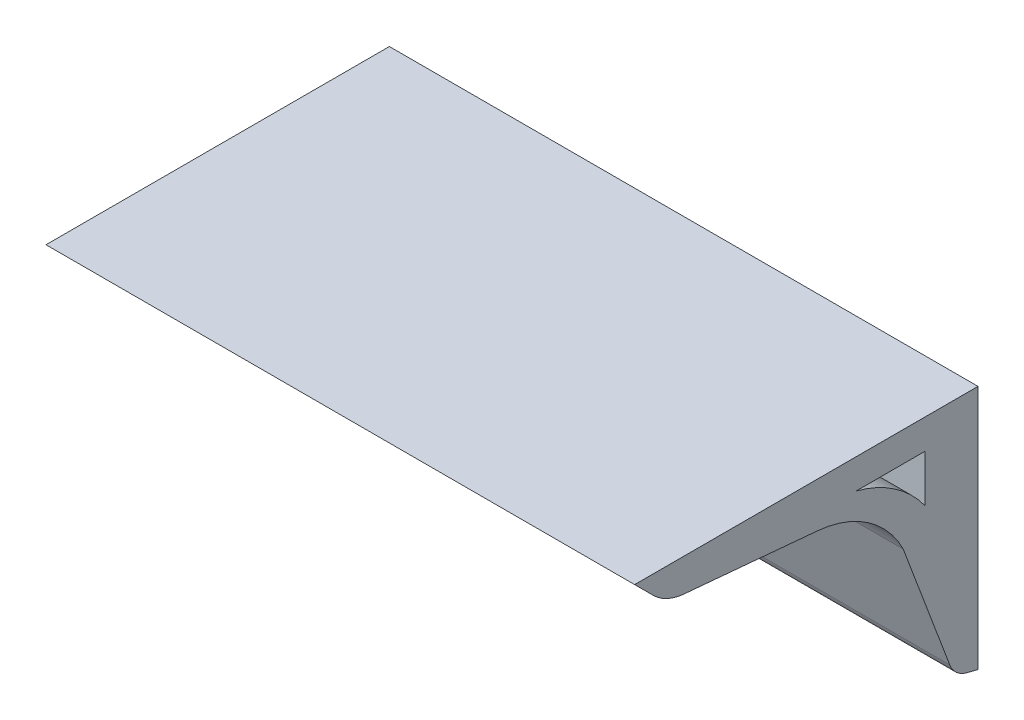
ISO-10303-21;
HEADER;
FILE_DESCRIPTION(('STEP AP214'),'2;1');
FILE_NAME('part.step','',(''),(''),'','','');
FILE_SCHEMA(('AUTOMOTIVE_DESIGN { 1 0 10303 214 1 1 1 1 }'));
ENDSEC;
DATA;
#1=APPLICATION_CONTEXT('core data for automotive mechanical design processes');
#2=APPLICATION_PROTOCOL_DEFINITION('international standard','automotive_design',2000,#1);
#3=PRODUCT_CONTEXT('',#1,'mechanical');
#4=PRODUCT('Part','Part','',(#3));
#5=PRODUCT_RELATED_PRODUCT_CATEGORY('part','',(#4));
#6=PRODUCT_DEFINITION_FORMATION('','',#4);
#7=PRODUCT_DEFINITION_CONTEXT('part definition',#1,'design');
#8=PRODUCT_DEFINITION('design','',#6,#7);
#9=PRODUCT_DEFINITION_SHAPE('','',#8);
#10=(LENGTH_UNIT() NAMED_UNIT(*) SI_UNIT(.MILLI.,.METRE.));
#11=(NAMED_UNIT(*) PLANE_ANGLE_UNIT() SI_UNIT($,.RADIAN.));
#12=(NAMED_UNIT(*) SI_UNIT($,.STERADIAN.) SOLID_ANGLE_UNIT());
#13=UNCERTAINTY_MEASURE_WITH_UNIT(LENGTH_MEASURE(1.E-05),#10,'distance_accuracy_value','');
#14=(GEOMETRIC_REPRESENTATION_CONTEXT(3) GLOBAL_UNCERTAINTY_ASSIGNED_CONTEXT((#13)) GLOBAL_UNIT_ASSIGNED_CONTEXT((#10,
#11,#12)) REPRESENTATION_CONTEXT('',''));
#15=CARTESIAN_POINT('',(0.,0.,0.));
#16=DIRECTION('',(0.,0.,1.));
#17=DIRECTION('',(1.,0.,0.));
#18=AXIS2_PLACEMENT_3D('',#15,#16,#17);
#19=CARTESIAN_POINT('',(140.700947131315,68.6280068728522,70.));
#20=DIRECTION('',(1.,0.,0.));
#21=DIRECTION('',(0.,0.,-1.));
#22=AXIS2_PLACEMENT_3D('',#19,#20,#21);
#23=PLANE('',#22);
#24=DIRECTION('',(0.,0.,1.));
#25=VECTOR('',#24,1.);
#26=CARTESIAN_POINT('',(140.700947131315,62.5711137957243,70.));
#27=LINE('',#26,#25);
#28=CARTESIAN_POINT('',(140.700947131315,62.5711137957243,10.7770424674494));
#29=VERTEX_POINT('',#28);
#30=CARTESIAN_POINT('',(140.700947131315,62.5711137957243,24.848704028638));
#31=VERTEX_POINT('',#30);
#32=EDGE_CURVE('E233',#29,#31,#27,.T.);
#33=ORIENTED_EDGE('',*,*,#32,.T.);
#34=CARTESIAN_POINT('',(140.700947131315,38.4790367793491,31.0267040762182));
#35=DIRECTION('',(1.,0.,0.));
#36=DIRECTION('',(0.,0.,-1.));
#37=AXIS2_PLACEMENT_3D('',#34,#35,#36);
#38=CIRCLE('',#37,24.8715873950751);
#39=CARTESIAN_POINT('',(140.700947131315,52.9201954683604,10.7770424674494));
#40=VERTEX_POINT('',#39);
#41=EDGE_CURVE('E135',#31,#40,#38,.F.);
#42=ORIENTED_EDGE('',*,*,#41,.T.);
#43=DIRECTION('',(0.,1.,0.));
#44=VECTOR('',#43,1.);
#45=CARTESIAN_POINT('',(140.700947131315,68.6280068728522,10.7770424674494));
#46=LINE('',#45,#44);
#47=EDGE_CURVE('E229',#40,#29,#46,.T.);
#48=ORIENTED_EDGE('',*,*,#47,.T.);
#49=EDGE_LOOP('',(#33,#42,#48));
#50=FACE_BOUND('',#49,.T.);
#51=CARTESIAN_POINT('',(140.700947131315,71.903004848522,59.1328623519387));
#52=DIRECTION('',(1.,0.,0.));
#53=DIRECTION('',(0.,0.,-1.));
#54=AXIS2_PLACEMENT_3D('',#51,#52,#53);
#55=CIRCLE('',#54,10.);
#56=CARTESIAN_POINT('',(140.700947131315,61.9433702759419,60.030458686973));
#57=VERTEX_POINT('',#56);
#58=CARTESIAN_POINT('',(140.700947131315,64.8319370366565,66.2039301638042));
#59=VERTEX_POINT('',#58);
#60=EDGE_CURVE('E225',#57,#59,#55,.F.);
#61=ORIENTED_EDGE('',*,*,#60,.T.);
#62=DIRECTION('',(0.,0.707106781186538,0.707106781186557));
#63=VECTOR('',#62,1.);
#64=CARTESIAN_POINT('',(140.700947131315,68.6280068728522,70.));
#65=LINE('',#64,#63);
#66=CARTESIAN_POINT('',(140.700947131315,68.6280068728522,70.));
#67=VERTEX_POINT('',#66);
#68=EDGE_CURVE('E205',#59,#67,#65,.T.);
#69=ORIENTED_EDGE('',*,*,#68,.T.);
#70=DIRECTION('',(0.,0.,-1.));
#71=VECTOR('',#70,1.);
#72=CARTESIAN_POINT('',(140.700947131315,68.6280068728522,70.));
#73=LINE('',#72,#71);
#74=CARTESIAN_POINT('',(140.700947131315,68.6280068728522,0.));
#75=VERTEX_POINT('',#74);
#76=EDGE_CURVE('E51',#67,#75,#73,.T.);
#77=ORIENTED_EDGE('',*,*,#76,.T.);
#78=DIRECTION('',(0.,-1.,0.));
#79=VECTOR('',#78,1.);
#80=CARTESIAN_POINT('',(140.700947131315,68.6280068728522,0.));
#81=LINE('',#80,#79);
#82=CARTESIAN_POINT('',(140.700947131315,18.6280068728522,0.));
#83=VERTEX_POINT('',#82);
#84=EDGE_CURVE('E238',#75,#83,#81,.T.);
#85=ORIENTED_EDGE('',*,*,#84,.T.);
#86=DIRECTION('',(0.,0.24532267445049,0.969441481163489));
#87=VECTOR('',#86,1.);
#88=CARTESIAN_POINT('',(140.700947131315,38.2849859845883,77.6784738221457));
#89=LINE('',#88,#87);
#90=CARTESIAN_POINT('',(140.700947131315,19.2071184121206,2.28847475939471));
#91=VERTEX_POINT('',#90);
#92=EDGE_CURVE('E187',#83,#91,#89,.T.);
#93=ORIENTED_EDGE('',*,*,#92,.T.);
#94=CARTESIAN_POINT('',(140.700947131315,24.054325817938,1.06186138714228));
#95=DIRECTION('',(1.,0.,0.));
#96=DIRECTION('',(0.,0.,-1.));
#97=AXIS2_PLACEMENT_3D('',#94,#95,#96);
#98=CIRCLE('',#97,5.);
#99=CARTESIAN_POINT('',(140.700947131315,22.2912796470663,5.74071468676333));
#100=VERTEX_POINT('',#99);
#101=EDGE_CURVE('E209',#91,#100,#98,.F.);
#102=ORIENTED_EDGE('',*,*,#101,.T.);
#103=DIRECTION('',(0.,0.935770659924207,0.352609234174339));
#104=VECTOR('',#103,1.);
#105=CARTESIAN_POINT('',(140.700947131315,84.0698921491655,29.0196121513224));
#106=LINE('',#105,#104);
#107=CARTESIAN_POINT('',(140.700947131315,47.5412180213148,15.2551842190888));
#108=VERTEX_POINT('',#107);
#109=EDGE_CURVE('E213',#100,#108,#106,.T.);
#110=ORIENTED_EDGE('',*,*,#109,.T.);
#111=CARTESIAN_POINT('',(140.700947131315,37.9038258071813,34.6587826817915));
#112=DIRECTION('',(1.,0.,0.));
#113=DIRECTION('',(0.,0.,-1.));
#114=AXIS2_PLACEMENT_3D('',#111,#112,#113);
#115=CIRCLE('',#114,21.6651554804216);
#116=CARTESIAN_POINT('',(140.700947131315,59.4815289614943,32.714126266074));
#117=VERTEX_POINT('',#116);
#118=EDGE_CURVE('E217',#108,#117,#115,.T.);
#119=ORIENTED_EDGE('',*,*,#118,.T.);
#120=DIRECTION('',(0.,0.0897596335034322,0.995963457258011));
#121=VECTOR('',#120,1.);
#122=CARTESIAN_POINT('',(140.700947131315,62.8884772255384,70.517266044121));
#123=LINE('',#122,#121);
#124=EDGE_CURVE('E221',#117,#57,#123,.T.);
#125=ORIENTED_EDGE('',*,*,#124,.T.);
#126=EDGE_LOOP('',(#61,#69,#77,#85,#93,#102,#110,#119,#125));
#127=FACE_BOUND('',#126,.T.);
#128=ADVANCED_FACE('F43',(#50,#127),#23,.F.);
#129=CARTESIAN_POINT('',(260.700947131315,68.6280068728522,70.));
#130=DIRECTION('',(-1.,0.,0.));
#131=DIRECTION('',(0.,0.,1.));
#132=AXIS2_PLACEMENT_3D('',#129,#130,#131);
#133=PLANE('',#132);
#134=DIRECTION('',(0.,1.,0.));
#135=VECTOR('',#134,1.);
#136=CARTESIAN_POINT('',(260.700947131315,52.9201954683604,10.7770424674494));
#137=LINE('',#136,#135);
#138=CARTESIAN_POINT('',(260.700947131315,52.9201954683604,10.7770424674494));
#139=VERTEX_POINT('',#138);
#140=CARTESIAN_POINT('',(260.700947131315,62.5711137957243,10.7770424674494));
#141=VERTEX_POINT('',#140);
#142=EDGE_CURVE('E146',#139,#141,#137,.T.);
#143=ORIENTED_EDGE('',*,*,#142,.F.);
#144=CARTESIAN_POINT('',(260.700947131315,38.4790367793491,31.0267040762182));
#145=DIRECTION('',(-1.,0.,0.));
#146=DIRECTION('',(0.,0.,-1.));
#147=AXIS2_PLACEMENT_3D('',#144,#145,#146);
#148=CIRCLE('',#147,24.8715873950751);
#149=CARTESIAN_POINT('',(260.700947131315,62.5711137957243,24.848704028638));
#150=VERTEX_POINT('',#149);
#151=EDGE_CURVE('E66',#150,#139,#148,.T.);
#152=ORIENTED_EDGE('',*,*,#151,.F.);
#153=DIRECTION('',(0.,0.,1.));
#154=VECTOR('',#153,1.);
#155=CARTESIAN_POINT('',(260.700947131315,62.5711137957243,10.7770424674494));
#156=LINE('',#155,#154);
#157=EDGE_CURVE('E141',#141,#150,#156,.T.);
#158=ORIENTED_EDGE('',*,*,#157,.F.);
#159=EDGE_LOOP('',(#143,#152,#158));
#160=FACE_BOUND('',#159,.T.);
#161=DIRECTION('',(0.,0.,-1.));
#162=VECTOR('',#161,1.);
#163=CARTESIAN_POINT('',(260.700947131315,68.6280068728522,70.));
#164=LINE('',#163,#162);
#165=CARTESIAN_POINT('',(260.700947131315,68.6280068728522,70.));
#166=VERTEX_POINT('',#165);
#167=CARTESIAN_POINT('',(260.700947131315,68.6280068728522,0.));
#168=VERTEX_POINT('',#167);
#169=EDGE_CURVE('E11',#166,#168,#164,.T.);
#170=ORIENTED_EDGE('',*,*,#169,.F.);
#171=DIRECTION('',(0.,0.707106781186538,0.707106781186557));
#172=VECTOR('',#171,1.);
#173=CARTESIAN_POINT('',(260.700947131315,68.6280068728522,70.));
#174=LINE('',#173,#172);
#175=CARTESIAN_POINT('',(260.700947131315,64.8319370366565,66.2039301638042));
#176=VERTEX_POINT('',#175);
#177=EDGE_CURVE('E180',#176,#166,#174,.T.);
#178=ORIENTED_EDGE('',*,*,#177,.F.);
#179=CARTESIAN_POINT('',(260.700947131315,71.903004848522,59.1328623519387));
#180=DIRECTION('',(-1.,0.,0.));
#181=DIRECTION('',(0.,0.,-1.));
#182=AXIS2_PLACEMENT_3D('',#179,#180,#181);
#183=CIRCLE('',#182,10.);
#184=CARTESIAN_POINT('',(260.700947131315,61.9433702759419,60.030458686973));
#185=VERTEX_POINT('',#184);
#186=EDGE_CURVE('E176',#185,#176,#183,.T.);
#187=ORIENTED_EDGE('',*,*,#186,.F.);
#188=DIRECTION('',(0.,0.0897596335034321,0.995963457258011));
#189=VECTOR('',#188,1.);
#190=CARTESIAN_POINT('',(260.700947131315,61.9433702759419,60.030458686973));
#191=LINE('',#190,#189);
#192=CARTESIAN_POINT('',(260.700947131315,59.4815289614943,32.714126266074));
#193=VERTEX_POINT('',#192);
#194=EDGE_CURVE('E172',#193,#185,#191,.T.);
#195=ORIENTED_EDGE('',*,*,#194,.F.);
#196=CARTESIAN_POINT('',(260.700947131315,37.9038258071813,34.6587826817915));
#197=DIRECTION('',(1.,0.,0.));
#198=DIRECTION('',(0.,0.,1.));
#199=AXIS2_PLACEMENT_3D('',#196,#197,#198);
#200=CIRCLE('',#199,21.6651554804216);
#201=CARTESIAN_POINT('',(260.700947131315,47.5412180213148,15.2551842190888));
#202=VERTEX_POINT('',#201);
#203=EDGE_CURVE('E168',#202,#193,#200,.T.);
#204=ORIENTED_EDGE('',*,*,#203,.F.);
#205=DIRECTION('',(0.,0.935770659924207,0.352609234174339));
#206=VECTOR('',#205,1.);
#207=CARTESIAN_POINT('',(260.700947131315,47.5412180213148,15.2551842190888));
#208=LINE('',#207,#206);
#209=CARTESIAN_POINT('',(260.700947131315,22.2912796470663,5.74071468676333));
#210=VERTEX_POINT('',#209);
#211=EDGE_CURVE('E164',#210,#202,#208,.T.);
#212=ORIENTED_EDGE('',*,*,#211,.F.);
#213=CARTESIAN_POINT('',(260.700947131315,24.054325817938,1.06186138714228));
#214=DIRECTION('',(-1.,0.,0.));
#215=DIRECTION('',(0.,0.,-1.));
#216=AXIS2_PLACEMENT_3D('',#213,#214,#215);
#217=CIRCLE('',#216,5.);
#218=CARTESIAN_POINT('',(260.700947131315,19.2071184121206,2.28847475939471));
#219=VERTEX_POINT('',#218);
#220=EDGE_CURVE('E157',#219,#210,#217,.T.);
#221=ORIENTED_EDGE('',*,*,#220,.F.);
#222=DIRECTION('',(0.,0.24532267445049,0.969441481163489));
#223=VECTOR('',#222,1.);
#224=CARTESIAN_POINT('',(260.700947131315,19.2071184121206,2.28847475939471));
#225=LINE('',#224,#223);
#226=CARTESIAN_POINT('',(260.700947131315,18.6280068728522,0.));
#227=VERTEX_POINT('',#226);
#228=EDGE_CURVE('E152',#227,#219,#225,.T.);
#229=ORIENTED_EDGE('',*,*,#228,.F.);
#230=DIRECTION('',(0.,1.,0.));
#231=VECTOR('',#230,1.);
#232=CARTESIAN_POINT('',(260.700947131315,68.6280068728522,0.));
#233=LINE('',#232,#231);
#234=EDGE_CURVE('E249',#227,#168,#233,.T.);
#235=ORIENTED_EDGE('',*,*,#234,.T.);
#236=EDGE_LOOP('',(#170,#178,#187,#195,#204,#212,#221,#229,#235));
#237=FACE_BOUND('',#236,.T.);
#238=ADVANCED_FACE('F149',(#160,#237),#133,.F.);
#239=CARTESIAN_POINT('',(140.700947131315,68.6280068728522,70.));
#240=DIRECTION('',(0.,-1.,0.));
#241=DIRECTION('',(0.,0.,-1.));
#242=AXIS2_PLACEMENT_3D('',#239,#240,#241);
#243=PLANE('',#242);
#244=DIRECTION('',(-1.,0.,0.));
#245=VECTOR('',#244,1.);
#246=CARTESIAN_POINT('',(140.700947131315,68.6280068728522,0.));
#247=LINE('',#246,#245);
#248=EDGE_CURVE('E242',#168,#75,#247,.T.);
#249=ORIENTED_EDGE('',*,*,#248,.T.);
#250=ORIENTED_EDGE('',*,*,#76,.F.);
#251=DIRECTION('',(-1.,0.,0.));
#252=VECTOR('',#251,1.);
#253=CARTESIAN_POINT('',(140.700947131315,68.6280068728522,70.));
#254=LINE('',#253,#252);
#255=EDGE_CURVE('E239',#166,#67,#254,.T.);
#256=ORIENTED_EDGE('',*,*,#255,.F.);
#257=ORIENTED_EDGE('',*,*,#169,.T.);
#258=EDGE_LOOP('',(#249,#250,#256,#257));
#259=FACE_BOUND('',#258,.T.);
#260=ADVANCED_FACE('F293',(#259),#243,.F.);
#261=CARTESIAN_POINT('',(0.,0.,0.));
#262=DIRECTION('',(0.,0.,1.));
#263=DIRECTION('',(1.,0.,0.));
#264=AXIS2_PLACEMENT_3D('',#261,#262,#263);
#265=PLANE('',#264);
#266=ORIENTED_EDGE('',*,*,#84,.F.);
#267=ORIENTED_EDGE('',*,*,#248,.F.);
#268=ORIENTED_EDGE('',*,*,#234,.F.);
#269=DIRECTION('',(1.,0.,0.));
#270=VECTOR('',#269,1.);
#271=CARTESIAN_POINT('',(140.700947131315,18.6280068728522,0.));
#272=LINE('',#271,#270);
#273=EDGE_CURVE('E246',#83,#227,#272,.T.);
#274=ORIENTED_EDGE('',*,*,#273,.F.);
#275=EDGE_LOOP('',(#266,#267,#268,#274));
#276=FACE_BOUND('',#275,.T.);
#277=ADVANCED_FACE('F263',(#276),#265,.F.);
#278=CARTESIAN_POINT('',(139.700947131315,71.903004848522,59.1328623519387));
#279=DIRECTION('',(1.,0.,0.));
#280=DIRECTION('',(0.,0.,-1.));
#281=AXIS2_PLACEMENT_3D('',#278,#279,#280);
#282=CYLINDRICAL_SURFACE('',#281,10.);
#283=DIRECTION('',(1.,0.,0.));
#284=VECTOR('',#283,1.);
#285=CARTESIAN_POINT('',(139.700947131315,61.9433702759419,60.030458686973));
#286=LINE('',#285,#284);
#287=EDGE_CURVE('E188',#57,#185,#286,.T.);
#288=ORIENTED_EDGE('',*,*,#287,.T.);
#289=ORIENTED_EDGE('',*,*,#186,.T.);
#290=DIRECTION('',(1.,0.,0.));
#291=VECTOR('',#290,1.);
#292=CARTESIAN_POINT('',(139.700947131315,64.8319370366565,66.2039301638042));
#293=LINE('',#292,#291);
#294=EDGE_CURVE('E184',#59,#176,#293,.T.);
#295=ORIENTED_EDGE('',*,*,#294,.F.);
#296=ORIENTED_EDGE('',*,*,#60,.F.);
#297=EDGE_LOOP('',(#288,#289,#295,#296));
#298=FACE_BOUND('',#297,.T.);
#299=ADVANCED_FACE('F289',(#298),#282,.T.);
#300=CARTESIAN_POINT('',(139.700947131315,61.9433702759419,60.030458686973));
#301=DIRECTION('',(0.,0.995963457258011,-0.0897596335034322));
#302=DIRECTION('',(0.,0.0897596335034322,0.995963457258011));
#303=AXIS2_PLACEMENT_3D('',#300,#301,#302);
#304=PLANE('',#303);
#305=DIRECTION('',(1.,0.,0.));
#306=VECTOR('',#305,1.);
#307=CARTESIAN_POINT('',(139.700947131315,59.4815289614943,32.714126266074));
#308=LINE('',#307,#306);
#309=EDGE_CURVE('E191',#117,#193,#308,.T.);
#310=ORIENTED_EDGE('',*,*,#309,.T.);
#311=ORIENTED_EDGE('',*,*,#194,.T.);
#312=ORIENTED_EDGE('',*,*,#287,.F.);
#313=ORIENTED_EDGE('',*,*,#124,.F.);
#314=EDGE_LOOP('',(#310,#311,#312,#313));
#315=FACE_BOUND('',#314,.T.);
#316=ADVANCED_FACE('F284',(#315),#304,.F.);
#317=CARTESIAN_POINT('',(139.700947131315,37.9038258071813,34.6587826817915));
#318=DIRECTION('',(1.,0.,0.));
#319=DIRECTION('',(0.,0.,-1.));
#320=AXIS2_PLACEMENT_3D('',#317,#318,#319);
#321=CYLINDRICAL_SURFACE('',#320,21.6651554804216);
#322=DIRECTION('',(1.,0.,0.));
#323=VECTOR('',#322,1.);
#324=CARTESIAN_POINT('',(139.700947131315,47.5412180213148,15.2551842190888));
#325=LINE('',#324,#323);
#326=EDGE_CURVE('E194',#108,#202,#325,.T.);
#327=ORIENTED_EDGE('',*,*,#326,.T.);
#328=ORIENTED_EDGE('',*,*,#203,.T.);
#329=ORIENTED_EDGE('',*,*,#309,.F.);
#330=ORIENTED_EDGE('',*,*,#118,.F.);
#331=EDGE_LOOP('',(#327,#328,#329,#330));
#332=FACE_BOUND('',#331,.T.);
#333=ADVANCED_FACE('F280',(#332),#321,.F.);
#334=CARTESIAN_POINT('',(139.700947131315,47.5412180213148,15.2551842190888));
#335=DIRECTION('',(0.,0.352609234174339,-0.935770659924207));
#336=DIRECTION('',(0.,0.935770659924207,0.352609234174339));
#337=AXIS2_PLACEMENT_3D('',#334,#335,#336);
#338=PLANE('',#337);
#339=DIRECTION('',(1.,0.,0.));
#340=VECTOR('',#339,1.);
#341=CARTESIAN_POINT('',(139.700947131315,22.2912796470663,5.74071468676333));
#342=LINE('',#341,#340);
#343=EDGE_CURVE('E197',#100,#210,#342,.T.);
#344=ORIENTED_EDGE('',*,*,#343,.T.);
#345=ORIENTED_EDGE('',*,*,#211,.T.);
#346=ORIENTED_EDGE('',*,*,#326,.F.);
#347=ORIENTED_EDGE('',*,*,#109,.F.);
#348=EDGE_LOOP('',(#344,#345,#346,#347));
#349=FACE_BOUND('',#348,.T.);
#350=ADVANCED_FACE('F278',(#349),#338,.F.);
#351=CARTESIAN_POINT('',(139.700947131315,24.054325817938,1.06186138714228));
#352=DIRECTION('',(1.,0.,0.));
#353=DIRECTION('',(0.,0.,-1.));
#354=AXIS2_PLACEMENT_3D('',#351,#352,#353);
#355=CYLINDRICAL_SURFACE('',#354,5.);
#356=DIRECTION('',(1.,0.,0.));
#357=VECTOR('',#356,1.);
#358=CARTESIAN_POINT('',(139.700947131315,19.2071184121206,2.28847475939471));
#359=LINE('',#358,#357);
#360=EDGE_CURVE('E183',#91,#219,#359,.T.);
#361=ORIENTED_EDGE('',*,*,#360,.T.);
#362=ORIENTED_EDGE('',*,*,#220,.T.);
#363=ORIENTED_EDGE('',*,*,#343,.F.);
#364=ORIENTED_EDGE('',*,*,#101,.F.);
#365=EDGE_LOOP('',(#361,#362,#363,#364));
#366=FACE_BOUND('',#365,.T.);
#367=ADVANCED_FACE('F275',(#366),#355,.T.);
#368=CARTESIAN_POINT('',(139.700947131315,68.6280068728522,70.));
#369=DIRECTION('',(0.,0.707106781186557,-0.707106781186538));
#370=DIRECTION('',(0.,0.707106781186538,0.707106781186557));
#371=AXIS2_PLACEMENT_3D('',#368,#369,#370);
#372=PLANE('',#371);
#373=ORIENTED_EDGE('',*,*,#294,.T.);
#374=ORIENTED_EDGE('',*,*,#177,.T.);
#375=ORIENTED_EDGE('',*,*,#255,.T.);
#376=ORIENTED_EDGE('',*,*,#68,.F.);
#377=EDGE_LOOP('',(#373,#374,#375,#376));
#378=FACE_BOUND('',#377,.T.);
#379=ADVANCED_FACE('F292',(#378),#372,.F.);
#380=CARTESIAN_POINT('',(139.700947131315,19.2071184121206,2.28847475939471));
#381=DIRECTION('',(0.,0.969441481163489,-0.24532267445049));
#382=DIRECTION('',(0.,0.24532267445049,0.969441481163489));
#383=AXIS2_PLACEMENT_3D('',#380,#381,#382);
#384=PLANE('',#383);
#385=ORIENTED_EDGE('',*,*,#273,.T.);
#386=ORIENTED_EDGE('',*,*,#228,.T.);
#387=ORIENTED_EDGE('',*,*,#360,.F.);
#388=ORIENTED_EDGE('',*,*,#92,.F.);
#389=EDGE_LOOP('',(#385,#386,#387,#388));
#390=FACE_BOUND('',#389,.T.);
#391=ADVANCED_FACE('F267',(#390),#384,.F.);
#392=CARTESIAN_POINT('',(139.700947131315,38.4790367793491,31.0267040762182));
#393=DIRECTION('',(1.,0.,0.));
#394=DIRECTION('',(0.,0.,-1.));
#395=AXIS2_PLACEMENT_3D('',#392,#393,#394);
#396=CYLINDRICAL_SURFACE('',#395,24.8715873950751);
#397=DIRECTION('',(1.,0.,0.));
#398=VECTOR('',#397,1.);
#399=CARTESIAN_POINT('',(139.700947131315,62.5711137957243,24.848704028638));
#400=LINE('',#399,#398);
#401=EDGE_CURVE('E131',#31,#150,#400,.T.);
#402=ORIENTED_EDGE('',*,*,#401,.T.);
#403=ORIENTED_EDGE('',*,*,#151,.T.);
#404=DIRECTION('',(1.,0.,0.));
#405=VECTOR('',#404,1.);
#406=CARTESIAN_POINT('',(139.700947131315,52.9201954683604,10.7770424674494));
#407=LINE('',#406,#405);
#408=EDGE_CURVE('E147',#40,#139,#407,.T.);
#409=ORIENTED_EDGE('',*,*,#408,.F.);
#410=ORIENTED_EDGE('',*,*,#41,.F.);
#411=EDGE_LOOP('',(#402,#403,#409,#410));
#412=FACE_BOUND('',#411,.T.);
#413=ADVANCED_FACE('F133',(#412),#396,.T.);
#414=CARTESIAN_POINT('',(139.700947131315,62.5711137957243,10.7770424674494));
#415=DIRECTION('',(0.,1.,0.));
#416=DIRECTION('',(0.,0.,1.));
#417=AXIS2_PLACEMENT_3D('',#414,#415,#416);
#418=PLANE('',#417);
#419=DIRECTION('',(1.,0.,0.));
#420=VECTOR('',#419,1.);
#421=CARTESIAN_POINT('',(139.700947131315,62.5711137957243,10.7770424674494));
#422=LINE('',#421,#420);
#423=EDGE_CURVE('E58',#29,#141,#422,.T.);
#424=ORIENTED_EDGE('',*,*,#423,.T.);
#425=ORIENTED_EDGE('',*,*,#157,.T.);
#426=ORIENTED_EDGE('',*,*,#401,.F.);
#427=ORIENTED_EDGE('',*,*,#32,.F.);
#428=EDGE_LOOP('',(#424,#425,#426,#427));
#429=FACE_BOUND('',#428,.T.);
#430=ADVANCED_FACE('F142',(#429),#418,.F.);
#431=CARTESIAN_POINT('',(139.700947131315,52.9201954683604,10.7770424674494));
#432=DIRECTION('',(0.,0.,-1.));
#433=DIRECTION('',(-1.,0.,0.));
#434=AXIS2_PLACEMENT_3D('',#431,#432,#433);
#435=PLANE('',#434);
#436=ORIENTED_EDGE('',*,*,#408,.T.);
#437=ORIENTED_EDGE('',*,*,#142,.T.);
#438=ORIENTED_EDGE('',*,*,#423,.F.);
#439=ORIENTED_EDGE('',*,*,#47,.F.);
#440=EDGE_LOOP('',(#436,#437,#438,#439));
#441=FACE_BOUND('',#440,.T.);
#442=ADVANCED_FACE('F305',(#441),#435,.F.);
#443=CLOSED_SHELL('',(#128,#238,#260,#277,#299,#316,#333,#350,#367,#379,#391,#413,#430,#442));
#444=MANIFOLD_SOLID_BREP('B2',#443);
#445=ADVANCED_BREP_SHAPE_REPRESENTATION('',(#18,#444),#14);
#446=SHAPE_DEFINITION_REPRESENTATION(#9,#445);
ENDSEC;
END-ISO-10303-21;
